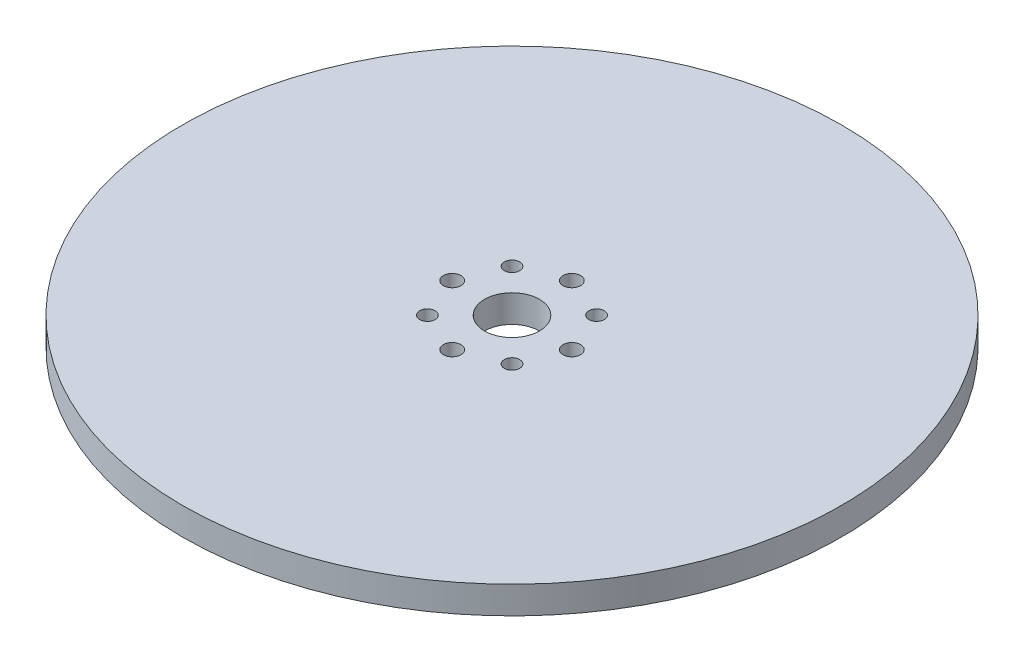
ISO-10303-21;
HEADER;
FILE_DESCRIPTION(('STEP AP214'),'2;1');
FILE_NAME('part.step','',(''),(''),'','','');
FILE_SCHEMA(('AUTOMOTIVE_DESIGN { 1 0 10303 214 1 1 1 1 }'));
ENDSEC;
DATA;
#1=APPLICATION_CONTEXT('core data for automotive mechanical design processes');
#2=APPLICATION_PROTOCOL_DEFINITION('international standard','automotive_design',2000,#1);
#3=PRODUCT_CONTEXT('',#1,'mechanical');
#4=PRODUCT('Part','Part','',(#3));
#5=PRODUCT_RELATED_PRODUCT_CATEGORY('part','',(#4));
#6=PRODUCT_DEFINITION_FORMATION('','',#4);
#7=PRODUCT_DEFINITION_CONTEXT('part definition',#1,'design');
#8=PRODUCT_DEFINITION('design','',#6,#7);
#9=PRODUCT_DEFINITION_SHAPE('','',#8);
#10=(LENGTH_UNIT() NAMED_UNIT(*) SI_UNIT(.MILLI.,.METRE.));
#11=(NAMED_UNIT(*) PLANE_ANGLE_UNIT() SI_UNIT($,.RADIAN.));
#12=(NAMED_UNIT(*) SI_UNIT($,.STERADIAN.) SOLID_ANGLE_UNIT());
#13=UNCERTAINTY_MEASURE_WITH_UNIT(LENGTH_MEASURE(1.E-05),#10,'distance_accuracy_value','');
#14=(GEOMETRIC_REPRESENTATION_CONTEXT(3) GLOBAL_UNCERTAINTY_ASSIGNED_CONTEXT((#13)) GLOBAL_UNIT_ASSIGNED_CONTEXT((#10,
#11,#12)) REPRESENTATION_CONTEXT('',''));
#15=CARTESIAN_POINT('',(0.,0.,0.));
#16=DIRECTION('',(0.,0.,1.));
#17=DIRECTION('',(1.,0.,0.));
#18=AXIS2_PLACEMENT_3D('',#15,#16,#17);
#19=CARTESIAN_POINT('',(0.,6.35,0.));
#20=DIRECTION('',(0.,1.,0.));
#21=DIRECTION('',(0.,0.,1.));
#22=AXIS2_PLACEMENT_3D('',#19,#20,#21);
#23=PLANE('',#22);
#24=CARTESIAN_POINT('',(9.77899999999993,6.35,9.77900000000007));
#25=DIRECTION('',(0.,1.,0.));
#26=DIRECTION('',(0.,0.,1.));
#27=AXIS2_PLACEMENT_3D('',#24,#25,#26);
#28=CIRCLE('',#27,1.778);
#29=CARTESIAN_POINT('',(9.77899999999993,6.35,11.5570000000001));
#30=VERTEX_POINT('',#29);
#31=EDGE_CURVE('E83',#30,#30,#28,.T.);
#32=ORIENTED_EDGE('',*,*,#31,.F.);
#33=EDGE_LOOP('',(#32));
#34=FACE_BOUND('',#33,.T.);
#35=CARTESIAN_POINT('',(-13.8295944264465,6.35,-1.62204547350889E-13));
#36=DIRECTION('',(0.,1.,0.));
#37=DIRECTION('',(0.,0.,1.));
#38=AXIS2_PLACEMENT_3D('',#35,#36,#37);
#39=CIRCLE('',#38,2.032);
#40=CARTESIAN_POINT('',(-13.8295944264465,6.35,2.03199999999984));
#41=VERTEX_POINT('',#40);
#42=EDGE_CURVE('E71',#41,#41,#39,.T.);
#43=ORIENTED_EDGE('',*,*,#42,.F.);
#44=EDGE_LOOP('',(#43));
#45=FACE_BOUND('',#44,.T.);
#46=CARTESIAN_POINT('',(13.8295944264465,6.35,0.));
#47=DIRECTION('',(0.,1.,0.));
#48=DIRECTION('',(0.,0.,1.));
#49=AXIS2_PLACEMENT_3D('',#46,#47,#48);
#50=CIRCLE('',#49,2.032);
#51=CARTESIAN_POINT('',(13.8295944264465,6.35,2.03200000000007));
#52=VERTEX_POINT('',#51);
#53=EDGE_CURVE('E59',#52,#52,#50,.T.);
#54=ORIENTED_EDGE('',*,*,#53,.F.);
#55=EDGE_LOOP('',(#54));
#56=FACE_BOUND('',#55,.T.);
#57=CARTESIAN_POINT('',(0.,6.35,-13.8295944264465));
#58=DIRECTION('',(0.,1.,0.));
#59=DIRECTION('',(0.,0.,1.));
#60=AXIS2_PLACEMENT_3D('',#57,#58,#59);
#61=CIRCLE('',#60,2.032);
#62=CARTESIAN_POINT('',(0.,6.35,-11.7975944264465));
#63=VERTEX_POINT('',#62);
#64=EDGE_CURVE('E47',#63,#63,#61,.T.);
#65=ORIENTED_EDGE('',*,*,#64,.F.);
#66=EDGE_LOOP('',(#65));
#67=FACE_BOUND('',#66,.T.);
#68=CARTESIAN_POINT('',(0.,6.35,0.));
#69=DIRECTION('',(0.,1.,0.));
#70=DIRECTION('',(0.,0.,1.));
#71=AXIS2_PLACEMENT_3D('',#68,#69,#70);
#72=CIRCLE('',#71,76.2);
#73=CARTESIAN_POINT('',(0.,6.35,76.2));
#74=VERTEX_POINT('',#73);
#75=EDGE_CURVE('E10',#74,#74,#72,.T.);
#76=ORIENTED_EDGE('',*,*,#75,.T.);
#77=EDGE_LOOP('',(#76));
#78=FACE_BOUND('',#77,.T.);
#79=CARTESIAN_POINT('',(0.,6.35,0.));
#80=DIRECTION('',(0.,1.,0.));
#81=DIRECTION('',(0.,0.,1.));
#82=AXIS2_PLACEMENT_3D('',#79,#80,#81);
#83=CIRCLE('',#82,6.35);
#84=CARTESIAN_POINT('',(0.,6.35,6.35));
#85=VERTEX_POINT('',#84);
#86=EDGE_CURVE('E42',#85,#85,#83,.T.);
#87=ORIENTED_EDGE('',*,*,#86,.F.);
#88=EDGE_LOOP('',(#87));
#89=FACE_BOUND('',#88,.T.);
#90=CARTESIAN_POINT('',(-9.779,6.35,-9.779));
#91=DIRECTION('',(0.,1.,0.));
#92=DIRECTION('',(0.,0.,1.));
#93=AXIS2_PLACEMENT_3D('',#90,#91,#92);
#94=CIRCLE('',#93,1.778);
#95=CARTESIAN_POINT('',(-9.779,6.35,-8.001));
#96=VERTEX_POINT('',#95);
#97=EDGE_CURVE('E53',#96,#96,#94,.T.);
#98=ORIENTED_EDGE('',*,*,#97,.F.);
#99=EDGE_LOOP('',(#98));
#100=FACE_BOUND('',#99,.T.);
#101=CARTESIAN_POINT('',(-1.13918776487182E-13,6.35,13.8295944264465));
#102=DIRECTION('',(0.,1.,0.));
#103=DIRECTION('',(0.,0.,1.));
#104=AXIS2_PLACEMENT_3D('',#101,#102,#103);
#105=CIRCLE('',#104,2.032);
#106=CARTESIAN_POINT('',(-1.13918776487182E-13,6.35,15.8615944264465));
#107=VERTEX_POINT('',#106);
#108=EDGE_CURVE('E65',#107,#107,#105,.T.);
#109=ORIENTED_EDGE('',*,*,#108,.F.);
#110=EDGE_LOOP('',(#109));
#111=FACE_BOUND('',#110,.T.);
#112=CARTESIAN_POINT('',(9.77900000000003,6.35,-9.77899999999997));
#113=DIRECTION('',(0.,1.,0.));
#114=DIRECTION('',(0.,0.,1.));
#115=AXIS2_PLACEMENT_3D('',#112,#113,#114);
#116=CIRCLE('',#115,1.778);
#117=CARTESIAN_POINT('',(9.77900000000003,6.35,-8.00099999999997));
#118=VERTEX_POINT('',#117);
#119=EDGE_CURVE('E77',#118,#118,#116,.T.);
#120=ORIENTED_EDGE('',*,*,#119,.F.);
#121=EDGE_LOOP('',(#120));
#122=FACE_BOUND('',#121,.T.);
#123=CARTESIAN_POINT('',(-9.7790000000001,6.35,9.7789999999999));
#124=DIRECTION('',(0.,1.,0.));
#125=DIRECTION('',(0.,0.,1.));
#126=AXIS2_PLACEMENT_3D('',#123,#124,#125);
#127=CIRCLE('',#126,1.778);
#128=CARTESIAN_POINT('',(-9.7790000000001,6.35,11.5569999999999));
#129=VERTEX_POINT('',#128);
#130=EDGE_CURVE('E89',#129,#129,#127,.T.);
#131=ORIENTED_EDGE('',*,*,#130,.F.);
#132=EDGE_LOOP('',(#131));
#133=FACE_BOUND('',#132,.T.);
#134=ADVANCED_FACE('F31',(#34,#45,#56,#67,#78,#89,#100,#111,#122,#133),#23,.T.);
#135=CARTESIAN_POINT('',(0.,0.,0.));
#136=DIRECTION('',(0.,1.,0.));
#137=DIRECTION('',(0.,0.,1.));
#138=AXIS2_PLACEMENT_3D('',#135,#136,#137);
#139=PLANE('',#138);
#140=CARTESIAN_POINT('',(0.,0.,0.));
#141=DIRECTION('',(0.,1.,0.));
#142=DIRECTION('',(0.,0.,1.));
#143=AXIS2_PLACEMENT_3D('',#140,#141,#142);
#144=CIRCLE('',#143,76.2);
#145=CARTESIAN_POINT('',(0.,0.,76.2));
#146=VERTEX_POINT('',#145);
#147=EDGE_CURVE('E35',#146,#146,#144,.T.);
#148=ORIENTED_EDGE('',*,*,#147,.F.);
#149=EDGE_LOOP('',(#148));
#150=FACE_BOUND('',#149,.T.);
#151=CARTESIAN_POINT('',(0.,0.,0.));
#152=DIRECTION('',(0.,1.,0.));
#153=DIRECTION('',(0.,0.,1.));
#154=AXIS2_PLACEMENT_3D('',#151,#152,#153);
#155=CIRCLE('',#154,6.35);
#156=CARTESIAN_POINT('',(0.,0.,6.35));
#157=VERTEX_POINT('',#156);
#158=EDGE_CURVE('E44',#157,#157,#155,.T.);
#159=ORIENTED_EDGE('',*,*,#158,.T.);
#160=EDGE_LOOP('',(#159));
#161=FACE_BOUND('',#160,.T.);
#162=CARTESIAN_POINT('',(0.,0.,-13.8295944264465));
#163=DIRECTION('',(0.,1.,0.));
#164=DIRECTION('',(0.,0.,1.));
#165=AXIS2_PLACEMENT_3D('',#162,#163,#164);
#166=CIRCLE('',#165,2.032);
#167=CARTESIAN_POINT('',(0.,0.,-11.7975944264465));
#168=VERTEX_POINT('',#167);
#169=EDGE_CURVE('E50',#168,#168,#166,.T.);
#170=ORIENTED_EDGE('',*,*,#169,.T.);
#171=EDGE_LOOP('',(#170));
#172=FACE_BOUND('',#171,.T.);
#173=CARTESIAN_POINT('',(-9.779,0.,-9.779));
#174=DIRECTION('',(0.,1.,0.));
#175=DIRECTION('',(0.,0.,1.));
#176=AXIS2_PLACEMENT_3D('',#173,#174,#175);
#177=CIRCLE('',#176,1.778);
#178=CARTESIAN_POINT('',(-9.779,0.,-8.001));
#179=VERTEX_POINT('',#178);
#180=EDGE_CURVE('E56',#179,#179,#177,.T.);
#181=ORIENTED_EDGE('',*,*,#180,.T.);
#182=EDGE_LOOP('',(#181));
#183=FACE_BOUND('',#182,.T.);
#184=CARTESIAN_POINT('',(13.8295944264465,0.,0.));
#185=DIRECTION('',(0.,1.,0.));
#186=DIRECTION('',(0.,0.,1.));
#187=AXIS2_PLACEMENT_3D('',#184,#185,#186);
#188=CIRCLE('',#187,2.032);
#189=CARTESIAN_POINT('',(13.8295944264465,0.,2.03200000000007));
#190=VERTEX_POINT('',#189);
#191=EDGE_CURVE('E62',#190,#190,#188,.T.);
#192=ORIENTED_EDGE('',*,*,#191,.T.);
#193=EDGE_LOOP('',(#192));
#194=FACE_BOUND('',#193,.T.);
#195=CARTESIAN_POINT('',(-1.13918776487182E-13,0.,13.8295944264465));
#196=DIRECTION('',(0.,1.,0.));
#197=DIRECTION('',(0.,0.,1.));
#198=AXIS2_PLACEMENT_3D('',#195,#196,#197);
#199=CIRCLE('',#198,2.032);
#200=CARTESIAN_POINT('',(-1.13918776487182E-13,0.,15.8615944264465));
#201=VERTEX_POINT('',#200);
#202=EDGE_CURVE('E68',#201,#201,#199,.T.);
#203=ORIENTED_EDGE('',*,*,#202,.T.);
#204=EDGE_LOOP('',(#203));
#205=FACE_BOUND('',#204,.T.);
#206=CARTESIAN_POINT('',(-13.8295944264465,0.,-1.62204547350889E-13));
#207=DIRECTION('',(0.,1.,0.));
#208=DIRECTION('',(0.,0.,1.));
#209=AXIS2_PLACEMENT_3D('',#206,#207,#208);
#210=CIRCLE('',#209,2.032);
#211=CARTESIAN_POINT('',(-13.8295944264465,0.,2.03199999999984));
#212=VERTEX_POINT('',#211);
#213=EDGE_CURVE('E74',#212,#212,#210,.T.);
#214=ORIENTED_EDGE('',*,*,#213,.T.);
#215=EDGE_LOOP('',(#214));
#216=FACE_BOUND('',#215,.T.);
#217=CARTESIAN_POINT('',(9.77900000000003,0.,-9.77899999999997));
#218=DIRECTION('',(0.,1.,0.));
#219=DIRECTION('',(0.,0.,1.));
#220=AXIS2_PLACEMENT_3D('',#217,#218,#219);
#221=CIRCLE('',#220,1.778);
#222=CARTESIAN_POINT('',(9.77900000000003,0.,-8.00099999999997));
#223=VERTEX_POINT('',#222);
#224=EDGE_CURVE('E80',#223,#223,#221,.T.);
#225=ORIENTED_EDGE('',*,*,#224,.T.);
#226=EDGE_LOOP('',(#225));
#227=FACE_BOUND('',#226,.T.);
#228=CARTESIAN_POINT('',(9.77899999999993,0.,9.77900000000007));
#229=DIRECTION('',(0.,1.,0.));
#230=DIRECTION('',(0.,0.,1.));
#231=AXIS2_PLACEMENT_3D('',#228,#229,#230);
#232=CIRCLE('',#231,1.778);
#233=CARTESIAN_POINT('',(9.77899999999993,0.,11.5570000000001));
#234=VERTEX_POINT('',#233);
#235=EDGE_CURVE('E86',#234,#234,#232,.T.);
#236=ORIENTED_EDGE('',*,*,#235,.T.);
#237=EDGE_LOOP('',(#236));
#238=FACE_BOUND('',#237,.T.);
#239=CARTESIAN_POINT('',(-9.7790000000001,0.,9.7789999999999));
#240=DIRECTION('',(0.,1.,0.));
#241=DIRECTION('',(0.,0.,1.));
#242=AXIS2_PLACEMENT_3D('',#239,#240,#241);
#243=CIRCLE('',#242,1.778);
#244=CARTESIAN_POINT('',(-9.7790000000001,0.,11.5569999999999));
#245=VERTEX_POINT('',#244);
#246=EDGE_CURVE('E92',#245,#245,#243,.T.);
#247=ORIENTED_EDGE('',*,*,#246,.T.);
#248=EDGE_LOOP('',(#247));
#249=FACE_BOUND('',#248,.T.);
#250=ADVANCED_FACE('F102',(#150,#161,#172,#183,#194,#205,#216,#227,#238,#249),#139,.F.);
#251=CARTESIAN_POINT('',(0.,6.35,0.));
#252=DIRECTION('',(0.,-1.,0.));
#253=DIRECTION('',(0.,0.,-1.));
#254=AXIS2_PLACEMENT_3D('',#251,#252,#253);
#255=CYLINDRICAL_SURFACE('',#254,76.2);
#256=ORIENTED_EDGE('',*,*,#75,.F.);
#257=EDGE_LOOP('',(#256));
#258=FACE_BOUND('',#257,.T.);
#259=ORIENTED_EDGE('',*,*,#147,.T.);
#260=EDGE_LOOP('',(#259));
#261=FACE_BOUND('',#260,.T.);
#262=ADVANCED_FACE('F33',(#258,#261),#255,.T.);
#263=CARTESIAN_POINT('',(0.,6.35,0.));
#264=DIRECTION('',(0.,-1.,0.));
#265=DIRECTION('',(0.,0.,-1.));
#266=AXIS2_PLACEMENT_3D('',#263,#264,#265);
#267=CYLINDRICAL_SURFACE('',#266,6.35);
#268=ORIENTED_EDGE('',*,*,#86,.T.);
#269=EDGE_LOOP('',(#268));
#270=FACE_BOUND('',#269,.T.);
#271=ORIENTED_EDGE('',*,*,#158,.F.);
#272=EDGE_LOOP('',(#271));
#273=FACE_BOUND('',#272,.T.);
#274=ADVANCED_FACE('F112',(#270,#273),#267,.F.);
#275=CARTESIAN_POINT('',(0.,6.35,-13.8295944264465));
#276=DIRECTION('',(0.,-1.,0.));
#277=DIRECTION('',(0.,0.,-1.));
#278=AXIS2_PLACEMENT_3D('',#275,#276,#277);
#279=CYLINDRICAL_SURFACE('',#278,2.032);
#280=ORIENTED_EDGE('',*,*,#64,.T.);
#281=EDGE_LOOP('',(#280));
#282=FACE_BOUND('',#281,.T.);
#283=ORIENTED_EDGE('',*,*,#169,.F.);
#284=EDGE_LOOP('',(#283));
#285=FACE_BOUND('',#284,.T.);
#286=ADVANCED_FACE('F115',(#282,#285),#279,.F.);
#287=CARTESIAN_POINT('',(-9.779,6.35,-9.779));
#288=DIRECTION('',(0.,-1.,0.));
#289=DIRECTION('',(0.,0.,-1.));
#290=AXIS2_PLACEMENT_3D('',#287,#288,#289);
#291=CYLINDRICAL_SURFACE('',#290,1.778);
#292=ORIENTED_EDGE('',*,*,#97,.T.);
#293=EDGE_LOOP('',(#292));
#294=FACE_BOUND('',#293,.T.);
#295=ORIENTED_EDGE('',*,*,#180,.F.);
#296=EDGE_LOOP('',(#295));
#297=FACE_BOUND('',#296,.T.);
#298=ADVANCED_FACE('F119',(#294,#297),#291,.F.);
#299=CARTESIAN_POINT('',(13.8295944264465,6.35,0.));
#300=DIRECTION('',(0.,-1.,0.));
#301=DIRECTION('',(0.,0.,-1.));
#302=AXIS2_PLACEMENT_3D('',#299,#300,#301);
#303=CYLINDRICAL_SURFACE('',#302,2.032);
#304=ORIENTED_EDGE('',*,*,#53,.T.);
#305=EDGE_LOOP('',(#304));
#306=FACE_BOUND('',#305,.T.);
#307=ORIENTED_EDGE('',*,*,#191,.F.);
#308=EDGE_LOOP('',(#307));
#309=FACE_BOUND('',#308,.T.);
#310=ADVANCED_FACE('F123',(#306,#309),#303,.F.);
#311=CARTESIAN_POINT('',(-1.13918776487182E-13,6.35,13.8295944264465));
#312=DIRECTION('',(0.,-1.,0.));
#313=DIRECTION('',(0.,0.,-1.));
#314=AXIS2_PLACEMENT_3D('',#311,#312,#313);
#315=CYLINDRICAL_SURFACE('',#314,2.032);
#316=ORIENTED_EDGE('',*,*,#108,.T.);
#317=EDGE_LOOP('',(#316));
#318=FACE_BOUND('',#317,.T.);
#319=ORIENTED_EDGE('',*,*,#202,.F.);
#320=EDGE_LOOP('',(#319));
#321=FACE_BOUND('',#320,.T.);
#322=ADVANCED_FACE('F127',(#318,#321),#315,.F.);
#323=CARTESIAN_POINT('',(-13.8295944264465,6.35,-1.62204547350889E-13));
#324=DIRECTION('',(0.,-1.,0.));
#325=DIRECTION('',(0.,0.,-1.));
#326=AXIS2_PLACEMENT_3D('',#323,#324,#325);
#327=CYLINDRICAL_SURFACE('',#326,2.032);
#328=ORIENTED_EDGE('',*,*,#42,.T.);
#329=EDGE_LOOP('',(#328));
#330=FACE_BOUND('',#329,.T.);
#331=ORIENTED_EDGE('',*,*,#213,.F.);
#332=EDGE_LOOP('',(#331));
#333=FACE_BOUND('',#332,.T.);
#334=ADVANCED_FACE('F131',(#330,#333),#327,.F.);
#335=CARTESIAN_POINT('',(9.77900000000003,6.35,-9.77899999999997));
#336=DIRECTION('',(0.,-1.,0.));
#337=DIRECTION('',(0.,0.,-1.));
#338=AXIS2_PLACEMENT_3D('',#335,#336,#337);
#339=CYLINDRICAL_SURFACE('',#338,1.778);
#340=ORIENTED_EDGE('',*,*,#119,.T.);
#341=EDGE_LOOP('',(#340));
#342=FACE_BOUND('',#341,.T.);
#343=ORIENTED_EDGE('',*,*,#224,.F.);
#344=EDGE_LOOP('',(#343));
#345=FACE_BOUND('',#344,.T.);
#346=ADVANCED_FACE('F135',(#342,#345),#339,.F.);
#347=CARTESIAN_POINT('',(9.77899999999993,6.35,9.77900000000007));
#348=DIRECTION('',(0.,-1.,0.));
#349=DIRECTION('',(0.,0.,-1.));
#350=AXIS2_PLACEMENT_3D('',#347,#348,#349);
#351=CYLINDRICAL_SURFACE('',#350,1.778);
#352=ORIENTED_EDGE('',*,*,#31,.T.);
#353=EDGE_LOOP('',(#352));
#354=FACE_BOUND('',#353,.T.);
#355=ORIENTED_EDGE('',*,*,#235,.F.);
#356=EDGE_LOOP('',(#355));
#357=FACE_BOUND('',#356,.T.);
#358=ADVANCED_FACE('F139',(#354,#357),#351,.F.);
#359=CARTESIAN_POINT('',(-9.7790000000001,6.35,9.7789999999999));
#360=DIRECTION('',(0.,-1.,0.));
#361=DIRECTION('',(0.,0.,-1.));
#362=AXIS2_PLACEMENT_3D('',#359,#360,#361);
#363=CYLINDRICAL_SURFACE('',#362,1.778);
#364=ORIENTED_EDGE('',*,*,#130,.T.);
#365=EDGE_LOOP('',(#364));
#366=FACE_BOUND('',#365,.T.);
#367=ORIENTED_EDGE('',*,*,#246,.F.);
#368=EDGE_LOOP('',(#367));
#369=FACE_BOUND('',#368,.T.);
#370=ADVANCED_FACE('F98',(#366,#369),#363,.F.);
#371=CLOSED_SHELL('',(#134,#250,#262,#274,#286,#298,#310,#322,#334,#346,#358,#370));
#372=MANIFOLD_SOLID_BREP('B2',#371);
#373=ADVANCED_BREP_SHAPE_REPRESENTATION('',(#18,#372),#14);
#374=SHAPE_DEFINITION_REPRESENTATION(#9,#373);
ENDSEC;
END-ISO-10303-21;
